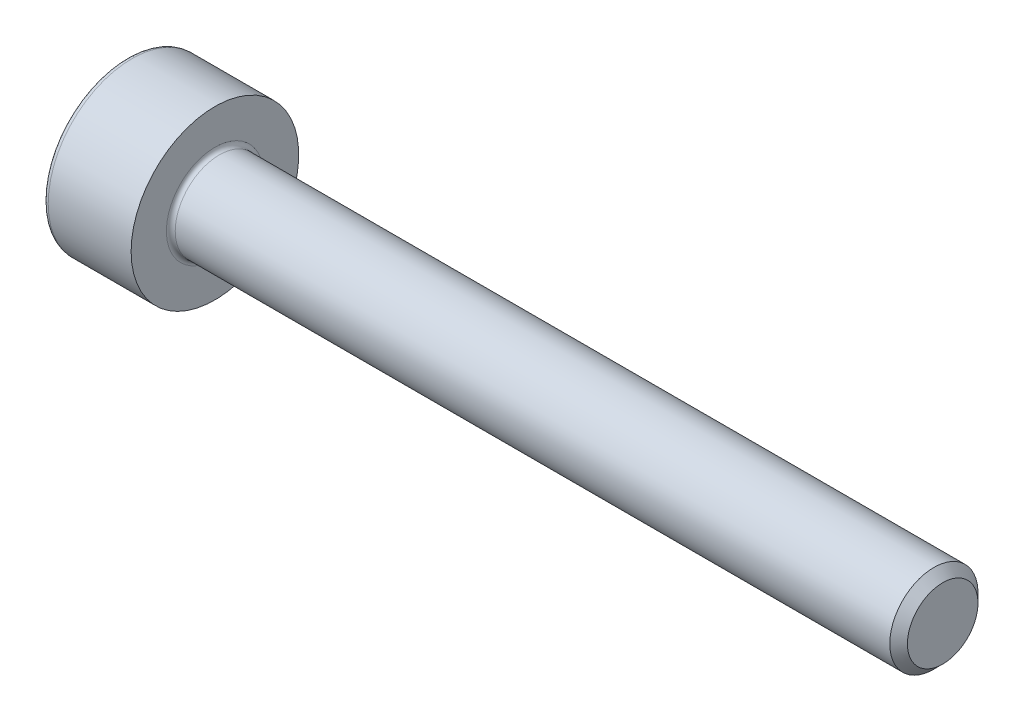
ISO-10303-21;
HEADER;
FILE_DESCRIPTION(('STEP AP214'),'2;1');
FILE_NAME('part.step','',(''),(''),'','','');
FILE_SCHEMA(('AUTOMOTIVE_DESIGN { 1 0 10303 214 1 1 1 1 }'));
ENDSEC;
DATA;
#1=APPLICATION_CONTEXT('core data for automotive mechanical design processes');
#2=APPLICATION_PROTOCOL_DEFINITION('international standard','automotive_design',2000,#1);
#3=PRODUCT_CONTEXT('',#1,'mechanical');
#4=PRODUCT('Part','Part','',(#3));
#5=PRODUCT_RELATED_PRODUCT_CATEGORY('part','',(#4));
#6=PRODUCT_DEFINITION_FORMATION('','',#4);
#7=PRODUCT_DEFINITION_CONTEXT('part definition',#1,'design');
#8=PRODUCT_DEFINITION('design','',#6,#7);
#9=PRODUCT_DEFINITION_SHAPE('','',#8);
#10=(LENGTH_UNIT() NAMED_UNIT(*) SI_UNIT(.MILLI.,.METRE.));
#11=(NAMED_UNIT(*) PLANE_ANGLE_UNIT() SI_UNIT($,.RADIAN.));
#12=(NAMED_UNIT(*) SI_UNIT($,.STERADIAN.) SOLID_ANGLE_UNIT());
#13=UNCERTAINTY_MEASURE_WITH_UNIT(LENGTH_MEASURE(1.E-05),#10,'distance_accuracy_value','');
#14=(GEOMETRIC_REPRESENTATION_CONTEXT(3) GLOBAL_UNCERTAINTY_ASSIGNED_CONTEXT((#13)) GLOBAL_UNIT_ASSIGNED_CONTEXT((#10,
#11,#12)) REPRESENTATION_CONTEXT('',''));
#15=CARTESIAN_POINT('',(0.,0.,0.));
#16=DIRECTION('',(0.,0.,1.));
#17=DIRECTION('',(1.,0.,0.));
#18=AXIS2_PLACEMENT_3D('',#15,#16,#17);
#19=CARTESIAN_POINT('',(18.5000000000048,0.,0.));
#20=DIRECTION('',(-1.,0.,0.));
#21=DIRECTION('',(0.,0.,1.));
#22=AXIS2_PLACEMENT_3D('',#19,#20,#21);
#23=PLANE('',#22);
#24=CARTESIAN_POINT('',(18.5000000000048,0.,0.));
#25=DIRECTION('',(-1.,0.,0.));
#26=DIRECTION('',(0.,0.,1.));
#27=AXIS2_PLACEMENT_3D('',#24,#25,#26);
#28=CIRCLE('',#27,0.8);
#29=CARTESIAN_POINT('',(18.5000000000048,0.,0.8));
#30=VERTEX_POINT('',#29);
#31=EDGE_CURVE('E11',#30,#30,#28,.F.);
#32=ORIENTED_EDGE('',*,*,#31,.T.);
#33=EDGE_LOOP('',(#32));
#34=FACE_BOUND('',#33,.T.);
#35=ADVANCED_FACE('F37',(#34),#23,.F.);
#36=CARTESIAN_POINT('',(0.,0.,0.));
#37=DIRECTION('',(-1.,0.,0.));
#38=DIRECTION('',(0.,0.,1.));
#39=AXIS2_PLACEMENT_3D('',#36,#37,#38);
#40=CYLINDRICAL_SURFACE('',#39,1.);
#41=CARTESIAN_POINT('',(18.3000000000048,0.,0.));
#42=DIRECTION('',(-1.,0.,0.));
#43=DIRECTION('',(0.,0.,1.));
#44=AXIS2_PLACEMENT_3D('',#41,#42,#43);
#45=CIRCLE('',#44,1.);
#46=CARTESIAN_POINT('',(18.3000000000048,0.,1.));
#47=VERTEX_POINT('',#46);
#48=EDGE_CURVE('E45',#47,#47,#45,.T.);
#49=ORIENTED_EDGE('',*,*,#48,.T.);
#50=EDGE_LOOP('',(#49));
#51=FACE_BOUND('',#50,.T.);
#52=CARTESIAN_POINT('',(2.10000000000477,0.,0.));
#53=DIRECTION('',(1.,0.,0.));
#54=DIRECTION('',(0.,0.,-1.));
#55=AXIS2_PLACEMENT_3D('',#52,#53,#54);
#56=CIRCLE('',#55,1.);
#57=CARTESIAN_POINT('',(2.10000000000477,0.,-1.));
#58=VERTEX_POINT('',#57);
#59=EDGE_CURVE('E150',#58,#58,#56,.T.);
#60=ORIENTED_EDGE('',*,*,#59,.T.);
#61=EDGE_LOOP('',(#60));
#62=FACE_BOUND('',#61,.T.);
#63=ADVANCED_FACE('F161',(#51,#62),#40,.T.);
#64=CARTESIAN_POINT('',(2.00000000000477,0.,0.));
#65=DIRECTION('',(1.,0.,0.));
#66=DIRECTION('',(0.,0.,-1.));
#67=AXIS2_PLACEMENT_3D('',#64,#65,#66);
#68=PLANE('',#67);
#69=CARTESIAN_POINT('',(2.00000000000477,0.,0.));
#70=DIRECTION('',(1.,0.,0.));
#71=DIRECTION('',(0.,0.,-1.));
#72=AXIS2_PLACEMENT_3D('',#69,#70,#71);
#73=CIRCLE('',#72,1.1);
#74=CARTESIAN_POINT('',(2.00000000000477,0.,-1.1));
#75=VERTEX_POINT('',#74);
#76=EDGE_CURVE('E147',#75,#75,#73,.F.);
#77=ORIENTED_EDGE('',*,*,#76,.T.);
#78=EDGE_LOOP('',(#77));
#79=FACE_BOUND('',#78,.T.);
#80=CARTESIAN_POINT('',(2.00000000000477,0.,0.));
#81=DIRECTION('',(-1.,0.,0.));
#82=DIRECTION('',(0.,0.,1.));
#83=AXIS2_PLACEMENT_3D('',#80,#81,#82);
#84=CIRCLE('',#83,1.9);
#85=CARTESIAN_POINT('',(2.00000000000477,0.,1.9));
#86=VERTEX_POINT('',#85);
#87=EDGE_CURVE('E139',#86,#86,#84,.T.);
#88=ORIENTED_EDGE('',*,*,#87,.F.);
#89=EDGE_LOOP('',(#88));
#90=FACE_BOUND('',#89,.T.);
#91=ADVANCED_FACE('F183',(#79,#90),#68,.T.);
#92=CARTESIAN_POINT('',(0.,0.,0.));
#93=DIRECTION('',(-1.,0.,0.));
#94=DIRECTION('',(0.,0.,1.));
#95=AXIS2_PLACEMENT_3D('',#92,#93,#94);
#96=CYLINDRICAL_SURFACE('',#95,1.9);
#97=CARTESIAN_POINT('',(0.12,0.,0.));
#98=DIRECTION('',(-1.,0.,0.));
#99=DIRECTION('',(0.,0.,1.));
#100=AXIS2_PLACEMENT_3D('',#97,#98,#99);
#101=CIRCLE('',#100,1.9);
#102=CARTESIAN_POINT('',(0.12,0.,1.9));
#103=VERTEX_POINT('',#102);
#104=EDGE_CURVE('E156',#103,#103,#101,.F.);
#105=ORIENTED_EDGE('',*,*,#104,.T.);
#106=EDGE_LOOP('',(#105));
#107=FACE_BOUND('',#106,.T.);
#108=ORIENTED_EDGE('',*,*,#87,.T.);
#109=EDGE_LOOP('',(#108));
#110=FACE_BOUND('',#109,.T.);
#111=ADVANCED_FACE('F193',(#107,#110),#96,.T.);
#112=CARTESIAN_POINT('',(0.,0.,0.));
#113=DIRECTION('',(-1.,0.,0.));
#114=DIRECTION('',(0.,0.,1.));
#115=AXIS2_PLACEMENT_3D('',#112,#113,#114);
#116=PLANE('',#115);
#117=DIRECTION('',(0.,0.5,-0.866025403784439));
#118=VECTOR('',#117,1.);
#119=CARTESIAN_POINT('',(0.,0.43301270189222,0.749999999999999));
#120=LINE('',#119,#118);
#121=CARTESIAN_POINT('',(0.,0.43301270189222,0.749999999999999));
#122=VERTEX_POINT('',#121);
#123=CARTESIAN_POINT('',(0.,0.866025403784438,0.));
#124=VERTEX_POINT('',#123);
#125=EDGE_CURVE('E52',#122,#124,#120,.T.);
#126=ORIENTED_EDGE('',*,*,#125,.F.);
#127=DIRECTION('',(0.,1.,0.));
#128=VECTOR('',#127,1.);
#129=CARTESIAN_POINT('',(0.,-0.43301270189222,0.749999999999999));
#130=LINE('',#129,#128);
#131=CARTESIAN_POINT('',(0.,-0.43301270189222,0.749999999999999));
#132=VERTEX_POINT('',#131);
#133=EDGE_CURVE('E135',#132,#122,#130,.T.);
#134=ORIENTED_EDGE('',*,*,#133,.F.);
#135=DIRECTION('',(0.,0.5,0.866025403784439));
#136=VECTOR('',#135,1.);
#137=CARTESIAN_POINT('',(0.,-0.866025403784438,0.));
#138=LINE('',#137,#136);
#139=CARTESIAN_POINT('',(0.,-0.866025403784438,0.));
#140=VERTEX_POINT('',#139);
#141=EDGE_CURVE('E133',#140,#132,#138,.T.);
#142=ORIENTED_EDGE('',*,*,#141,.F.);
#143=DIRECTION('',(0.,-0.5,0.866025403784439));
#144=VECTOR('',#143,1.);
#145=CARTESIAN_POINT('',(0.,-0.433012701892219,-0.75));
#146=LINE('',#145,#144);
#147=CARTESIAN_POINT('',(0.,-0.433012701892219,-0.75));
#148=VERTEX_POINT('',#147);
#149=EDGE_CURVE('E100',#148,#140,#146,.T.);
#150=ORIENTED_EDGE('',*,*,#149,.F.);
#151=DIRECTION('',(0.,-1.,0.));
#152=VECTOR('',#151,1.);
#153=CARTESIAN_POINT('',(0.,0.433012701892219,-0.75));
#154=LINE('',#153,#152);
#155=CARTESIAN_POINT('',(0.,0.433012701892219,-0.75));
#156=VERTEX_POINT('',#155);
#157=EDGE_CURVE('E129',#156,#148,#154,.T.);
#158=ORIENTED_EDGE('',*,*,#157,.F.);
#159=DIRECTION('',(0.,-0.5,-0.866025403784439));
#160=VECTOR('',#159,1.);
#161=CARTESIAN_POINT('',(0.,0.866025403784438,0.));
#162=LINE('',#161,#160);
#163=EDGE_CURVE('E126',#124,#156,#162,.T.);
#164=ORIENTED_EDGE('',*,*,#163,.F.);
#165=EDGE_LOOP('',(#126,#134,#142,#150,#158,#164));
#166=FACE_BOUND('',#165,.T.);
#167=CARTESIAN_POINT('',(0.,0.,0.));
#168=DIRECTION('',(-1.,0.,0.));
#169=DIRECTION('',(0.,0.,1.));
#170=AXIS2_PLACEMENT_3D('',#167,#168,#169);
#171=CIRCLE('',#170,1.78);
#172=CARTESIAN_POINT('',(0.,0.,1.78));
#173=VERTEX_POINT('',#172);
#174=EDGE_CURVE('E153',#173,#173,#171,.T.);
#175=ORIENTED_EDGE('',*,*,#174,.T.);
#176=EDGE_LOOP('',(#175));
#177=FACE_BOUND('',#176,.T.);
#178=ADVANCED_FACE('F188',(#166,#177),#116,.T.);
#179=CARTESIAN_POINT('',(2.10000000000477,0.,0.));
#180=DIRECTION('',(1.,0.,0.));
#181=DIRECTION('',(0.,0.,-1.));
#182=AXIS2_PLACEMENT_3D('',#179,#180,#181);
#183=TOROIDAL_SURFACE('',#182,1.1,0.1);
#184=ORIENTED_EDGE('',*,*,#59,.F.);
#185=EDGE_LOOP('',(#184));
#186=FACE_BOUND('',#185,.T.);
#187=ORIENTED_EDGE('',*,*,#76,.F.);
#188=EDGE_LOOP('',(#187));
#189=FACE_BOUND('',#188,.T.);
#190=ADVANCED_FACE('F174',(#186,#189),#183,.F.);
#191=CARTESIAN_POINT('',(0.12,0.,0.));
#192=DIRECTION('',(-1.,0.,0.));
#193=DIRECTION('',(0.,0.,1.));
#194=AXIS2_PLACEMENT_3D('',#191,#192,#193);
#195=TOROIDAL_SURFACE('',#194,1.78,0.12);
#196=ORIENTED_EDGE('',*,*,#104,.F.);
#197=EDGE_LOOP('',(#196));
#198=FACE_BOUND('',#197,.T.);
#199=ORIENTED_EDGE('',*,*,#174,.F.);
#200=EDGE_LOOP('',(#199));
#201=FACE_BOUND('',#200,.T.);
#202=ADVANCED_FACE('F166',(#198,#201),#195,.T.);
#203=CARTESIAN_POINT('',(18.3000000000048,0.,0.));
#204=DIRECTION('',(-1.,0.,0.));
#205=DIRECTION('',(0.,0.,1.));
#206=AXIS2_PLACEMENT_3D('',#203,#204,#205);
#207=CONICAL_SURFACE('',#206,1.,0.785398163397446);
#208=ORIENTED_EDGE('',*,*,#31,.F.);
#209=EDGE_LOOP('',(#208));
#210=FACE_BOUND('',#209,.T.);
#211=ORIENTED_EDGE('',*,*,#48,.F.);
#212=EDGE_LOOP('',(#211));
#213=FACE_BOUND('',#212,.T.);
#214=ADVANCED_FACE('F39',(#210,#213),#207,.T.);
#215=CARTESIAN_POINT('',(1.,0.43301270189222,0.749999999999999));
#216=DIRECTION('',(0.,0.866025403784439,0.5));
#217=DIRECTION('',(0.,-0.5,0.866025403784439));
#218=AXIS2_PLACEMENT_3D('',#215,#216,#217);
#219=PLANE('',#218);
#220=ORIENTED_EDGE('',*,*,#125,.T.);
#221=DIRECTION('',(-1.,0.,0.));
#222=VECTOR('',#221,1.);
#223=CARTESIAN_POINT('',(1.,0.866025403784438,0.));
#224=LINE('',#223,#222);
#225=CARTESIAN_POINT('',(1.,0.866025403784438,0.));
#226=VERTEX_POINT('',#225);
#227=EDGE_CURVE('E82',#226,#124,#224,.T.);
#228=ORIENTED_EDGE('',*,*,#227,.F.);
#229=DIRECTION('',(0.,0.5,-0.866025403784439));
#230=VECTOR('',#229,1.);
#231=CARTESIAN_POINT('',(1.,0.43301270189222,0.749999999999999));
#232=LINE('',#231,#230);
#233=CARTESIAN_POINT('',(1.,0.43301270189222,0.749999999999999));
#234=VERTEX_POINT('',#233);
#235=EDGE_CURVE('E137',#234,#226,#232,.T.);
#236=ORIENTED_EDGE('',*,*,#235,.F.);
#237=DIRECTION('',(-1.,0.,0.));
#238=VECTOR('',#237,1.);
#239=CARTESIAN_POINT('',(1.,0.43301270189222,0.749999999999999));
#240=LINE('',#239,#238);
#241=EDGE_CURVE('E60',#234,#122,#240,.T.);
#242=ORIENTED_EDGE('',*,*,#241,.T.);
#243=EDGE_LOOP('',(#220,#228,#236,#242));
#244=FACE_BOUND('',#243,.T.);
#245=ADVANCED_FACE('F165',(#244),#219,.F.);
#246=CARTESIAN_POINT('',(1.,-0.43301270189222,0.749999999999999));
#247=DIRECTION('',(0.,0.,1.));
#248=DIRECTION('',(0.,-1.,0.));
#249=AXIS2_PLACEMENT_3D('',#246,#247,#248);
#250=PLANE('',#249);
#251=ORIENTED_EDGE('',*,*,#133,.T.);
#252=ORIENTED_EDGE('',*,*,#241,.F.);
#253=DIRECTION('',(0.,1.,0.));
#254=VECTOR('',#253,1.);
#255=CARTESIAN_POINT('',(1.,-0.43301270189222,0.749999999999999));
#256=LINE('',#255,#254);
#257=CARTESIAN_POINT('',(1.,-0.43301270189222,0.749999999999999));
#258=VERTEX_POINT('',#257);
#259=EDGE_CURVE('E112',#258,#234,#256,.T.);
#260=ORIENTED_EDGE('',*,*,#259,.F.);
#261=DIRECTION('',(-1.,0.,0.));
#262=VECTOR('',#261,1.);
#263=CARTESIAN_POINT('',(1.,-0.43301270189222,0.749999999999999));
#264=LINE('',#263,#262);
#265=EDGE_CURVE('E104',#258,#132,#264,.T.);
#266=ORIENTED_EDGE('',*,*,#265,.T.);
#267=EDGE_LOOP('',(#251,#252,#260,#266));
#268=FACE_BOUND('',#267,.T.);
#269=ADVANCED_FACE('F172',(#268),#250,.F.);
#270=CARTESIAN_POINT('',(1.,-0.866025403784438,0.));
#271=DIRECTION('',(0.,-0.866025403784439,0.5));
#272=DIRECTION('',(0.,-0.5,-0.866025403784439));
#273=AXIS2_PLACEMENT_3D('',#270,#271,#272);
#274=PLANE('',#273);
#275=ORIENTED_EDGE('',*,*,#141,.T.);
#276=ORIENTED_EDGE('',*,*,#265,.F.);
#277=DIRECTION('',(0.,0.5,0.866025403784439));
#278=VECTOR('',#277,1.);
#279=CARTESIAN_POINT('',(1.,-0.866025403784438,0.));
#280=LINE('',#279,#278);
#281=CARTESIAN_POINT('',(1.,-0.866025403784438,0.));
#282=VERTEX_POINT('',#281);
#283=EDGE_CURVE('E108',#282,#258,#280,.T.);
#284=ORIENTED_EDGE('',*,*,#283,.F.);
#285=DIRECTION('',(-1.,0.,0.));
#286=VECTOR('',#285,1.);
#287=CARTESIAN_POINT('',(1.,-0.866025403784438,0.));
#288=LINE('',#287,#286);
#289=EDGE_CURVE('E93',#282,#140,#288,.T.);
#290=ORIENTED_EDGE('',*,*,#289,.T.);
#291=EDGE_LOOP('',(#275,#276,#284,#290));
#292=FACE_BOUND('',#291,.T.);
#293=ADVANCED_FACE('F109',(#292),#274,.F.);
#294=CARTESIAN_POINT('',(1.,-0.433012701892219,-0.75));
#295=DIRECTION('',(0.,-0.866025403784439,-0.5));
#296=DIRECTION('',(0.,0.5,-0.866025403784439));
#297=AXIS2_PLACEMENT_3D('',#294,#295,#296);
#298=PLANE('',#297);
#299=ORIENTED_EDGE('',*,*,#149,.T.);
#300=ORIENTED_EDGE('',*,*,#289,.F.);
#301=DIRECTION('',(0.,-0.5,0.866025403784439));
#302=VECTOR('',#301,1.);
#303=CARTESIAN_POINT('',(1.,-0.433012701892219,-0.75));
#304=LINE('',#303,#302);
#305=CARTESIAN_POINT('',(1.,-0.433012701892219,-0.75));
#306=VERTEX_POINT('',#305);
#307=EDGE_CURVE('E97',#306,#282,#304,.T.);
#308=ORIENTED_EDGE('',*,*,#307,.F.);
#309=DIRECTION('',(-1.,0.,0.));
#310=VECTOR('',#309,1.);
#311=CARTESIAN_POINT('',(1.,-0.433012701892219,-0.75));
#312=LINE('',#311,#310);
#313=EDGE_CURVE('E105',#306,#148,#312,.T.);
#314=ORIENTED_EDGE('',*,*,#313,.T.);
#315=EDGE_LOOP('',(#299,#300,#308,#314));
#316=FACE_BOUND('',#315,.T.);
#317=ADVANCED_FACE('F95',(#316),#298,.F.);
#318=CARTESIAN_POINT('',(1.,0.433012701892219,-0.75));
#319=DIRECTION('',(0.,0.,-1.));
#320=DIRECTION('',(0.,1.,0.));
#321=AXIS2_PLACEMENT_3D('',#318,#319,#320);
#322=PLANE('',#321);
#323=ORIENTED_EDGE('',*,*,#157,.T.);
#324=ORIENTED_EDGE('',*,*,#313,.F.);
#325=DIRECTION('',(0.,-1.,0.));
#326=VECTOR('',#325,1.);
#327=CARTESIAN_POINT('',(1.,0.433012701892219,-0.75));
#328=LINE('',#327,#326);
#329=CARTESIAN_POINT('',(1.,0.433012701892219,-0.75));
#330=VERTEX_POINT('',#329);
#331=EDGE_CURVE('E118',#330,#306,#328,.T.);
#332=ORIENTED_EDGE('',*,*,#331,.F.);
#333=DIRECTION('',(-1.,0.,0.));
#334=VECTOR('',#333,1.);
#335=CARTESIAN_POINT('',(1.,0.433012701892219,-0.75));
#336=LINE('',#335,#334);
#337=EDGE_CURVE('E142',#330,#156,#336,.T.);
#338=ORIENTED_EDGE('',*,*,#337,.T.);
#339=EDGE_LOOP('',(#323,#324,#332,#338));
#340=FACE_BOUND('',#339,.T.);
#341=ADVANCED_FACE('F213',(#340),#322,.F.);
#342=CARTESIAN_POINT('',(1.,0.866025403784438,0.));
#343=DIRECTION('',(0.,0.866025403784439,-0.5));
#344=DIRECTION('',(0.,0.5,0.866025403784439));
#345=AXIS2_PLACEMENT_3D('',#342,#343,#344);
#346=PLANE('',#345);
#347=ORIENTED_EDGE('',*,*,#163,.T.);
#348=ORIENTED_EDGE('',*,*,#337,.F.);
#349=DIRECTION('',(0.,-0.5,-0.866025403784439));
#350=VECTOR('',#349,1.);
#351=CARTESIAN_POINT('',(1.,0.866025403784438,0.));
#352=LINE('',#351,#350);
#353=EDGE_CURVE('E120',#226,#330,#352,.T.);
#354=ORIENTED_EDGE('',*,*,#353,.F.);
#355=ORIENTED_EDGE('',*,*,#227,.T.);
#356=EDGE_LOOP('',(#347,#348,#354,#355));
#357=FACE_BOUND('',#356,.T.);
#358=ADVANCED_FACE('F210',(#357),#346,.F.);
#359=CARTESIAN_POINT('',(1.,0.,0.));
#360=DIRECTION('',(-1.,0.,0.));
#361=DIRECTION('',(0.,0.,1.));
#362=AXIS2_PLACEMENT_3D('',#359,#360,#361);
#363=PLANE('',#362);
#364=ORIENTED_EDGE('',*,*,#235,.T.);
#365=ORIENTED_EDGE('',*,*,#353,.T.);
#366=ORIENTED_EDGE('',*,*,#331,.T.);
#367=ORIENTED_EDGE('',*,*,#307,.T.);
#368=ORIENTED_EDGE('',*,*,#283,.T.);
#369=ORIENTED_EDGE('',*,*,#259,.T.);
#370=EDGE_LOOP('',(#364,#365,#366,#367,#368,#369));
#371=FACE_BOUND('',#370,.T.);
#372=ADVANCED_FACE('F115',(#371),#363,.T.);
#373=CLOSED_SHELL('',(#35,#63,#91,#111,#178,#190,#202,#214,#245,#269,#293,#317,#341,#358,#372));
#374=MANIFOLD_SOLID_BREP('B2',#373);
#375=ADVANCED_BREP_SHAPE_REPRESENTATION('',(#18,#374),#14);
#376=SHAPE_DEFINITION_REPRESENTATION(#9,#375);
ENDSEC;
END-ISO-10303-21;
